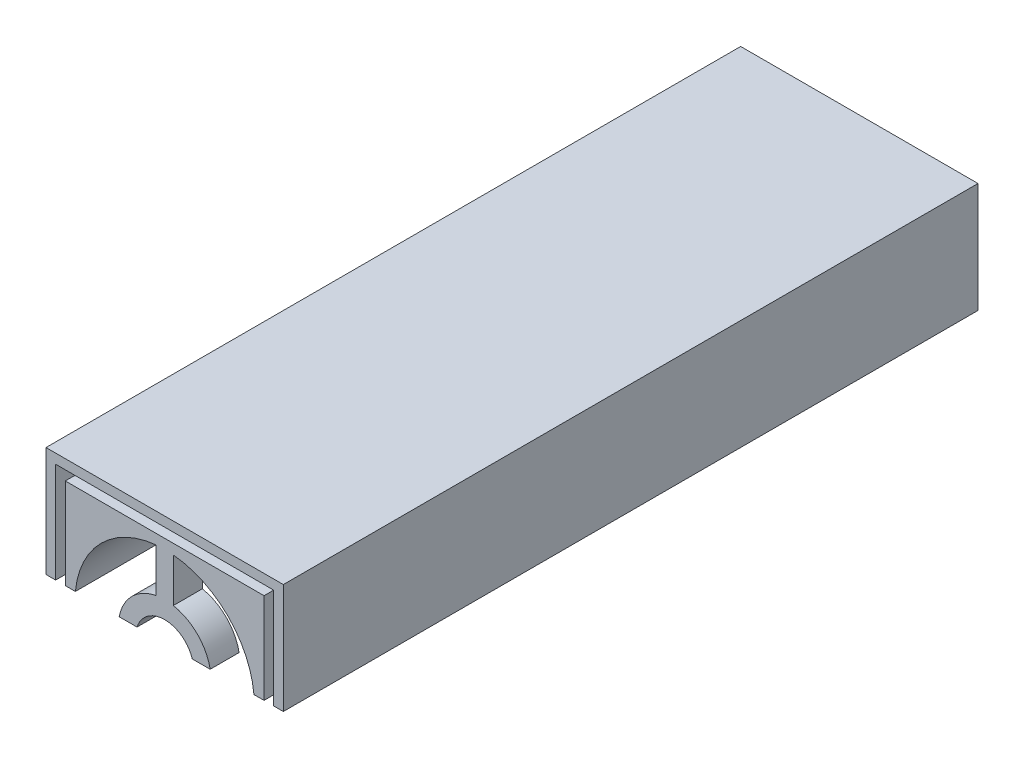
ISO-10303-21;
HEADER;
FILE_DESCRIPTION(('STEP AP214'),'2;1');
FILE_NAME('part.step','',(''),(''),'','','');
FILE_SCHEMA(('AUTOMOTIVE_DESIGN { 1 0 10303 214 1 1 1 1 }'));
ENDSEC;
DATA;
#1=APPLICATION_CONTEXT('core data for automotive mechanical design processes');
#2=APPLICATION_PROTOCOL_DEFINITION('international standard','automotive_design',2000,#1);
#3=PRODUCT_CONTEXT('',#1,'mechanical');
#4=PRODUCT('Part','Part','',(#3));
#5=PRODUCT_RELATED_PRODUCT_CATEGORY('part','',(#4));
#6=PRODUCT_DEFINITION_FORMATION('','',#4);
#7=PRODUCT_DEFINITION_CONTEXT('part definition',#1,'design');
#8=PRODUCT_DEFINITION('design','',#6,#7);
#9=PRODUCT_DEFINITION_SHAPE('','',#8);
#10=(LENGTH_UNIT() NAMED_UNIT(*) SI_UNIT(.MILLI.,.METRE.));
#11=(NAMED_UNIT(*) PLANE_ANGLE_UNIT() SI_UNIT($,.RADIAN.));
#12=(NAMED_UNIT(*) SI_UNIT($,.STERADIAN.) SOLID_ANGLE_UNIT());
#13=UNCERTAINTY_MEASURE_WITH_UNIT(LENGTH_MEASURE(1.E-05),#10,'distance_accuracy_value','');
#14=(GEOMETRIC_REPRESENTATION_CONTEXT(3) GLOBAL_UNCERTAINTY_ASSIGNED_CONTEXT((#13)) GLOBAL_UNIT_ASSIGNED_CONTEXT((#10,
#11,#12)) REPRESENTATION_CONTEXT('',''));
#15=CARTESIAN_POINT('',(0.,0.,0.));
#16=DIRECTION('',(0.,0.,1.));
#17=DIRECTION('',(1.,0.,0.));
#18=AXIS2_PLACEMENT_3D('',#15,#16,#17);
#19=CARTESIAN_POINT('',(0.,1.905,0.));
#20=DIRECTION('',(0.,1.,0.));
#21=DIRECTION('',(0.,0.,1.));
#22=AXIS2_PLACEMENT_3D('',#19,#20,#21);
#23=PLANE('',#22);
#24=DIRECTION('',(-1.,0.,0.));
#25=VECTOR('',#24,1.);
#26=CARTESIAN_POINT('',(0.,1.905,0.));
#27=LINE('',#26,#25);
#28=CARTESIAN_POINT('',(21.8017598,1.905,0.));
#29=VERTEX_POINT('',#28);
#30=CARTESIAN_POINT('',(19.5926057480877,1.905,0.));
#31=VERTEX_POINT('',#30);
#32=EDGE_CURVE('E571',#29,#31,#27,.T.);
#33=ORIENTED_EDGE('',*,*,#32,.T.);
#34=DIRECTION('',(0.,0.,1.));
#35=VECTOR('',#34,1.);
#36=CARTESIAN_POINT('',(19.5926057480877,1.905,-146.05));
#37=LINE('',#36,#35);
#38=CARTESIAN_POINT('',(19.5926057480877,1.905,-146.05));
#39=VERTEX_POINT('',#38);
#40=EDGE_CURVE('E526',#39,#31,#37,.T.);
#41=ORIENTED_EDGE('',*,*,#40,.F.);
#42=DIRECTION('',(-1.,0.,0.));
#43=VECTOR('',#42,1.);
#44=CARTESIAN_POINT('',(0.,1.905,-146.05));
#45=LINE('',#44,#43);
#46=CARTESIAN_POINT('',(6.05751392899761,1.905,-146.05));
#47=VERTEX_POINT('',#46);
#48=EDGE_CURVE('E550',#39,#47,#45,.T.);
#49=ORIENTED_EDGE('',*,*,#48,.T.);
#50=DIRECTION('',(0.,0.,1.));
#51=VECTOR('',#50,1.);
#52=CARTESIAN_POINT('',(6.0575139289976,1.905,-152.4));
#53=LINE('',#52,#51);
#54=CARTESIAN_POINT('',(6.05751392899761,1.905,-152.4));
#55=VERTEX_POINT('',#54);
#56=EDGE_CURVE('E541',#55,#47,#53,.T.);
#57=ORIENTED_EDGE('',*,*,#56,.F.);
#58=DIRECTION('',(-1.,0.,0.));
#59=VECTOR('',#58,1.);
#60=CARTESIAN_POINT('',(0.,1.905,-152.4));
#61=LINE('',#60,#59);
#62=CARTESIAN_POINT('',(26.035,1.905,-152.4));
#63=VERTEX_POINT('',#62);
#64=EDGE_CURVE('E551',#63,#55,#61,.T.);
#65=ORIENTED_EDGE('',*,*,#64,.F.);
#66=DIRECTION('',(0.,0.,1.));
#67=VECTOR('',#66,1.);
#68=CARTESIAN_POINT('',(26.035,1.905,-152.4));
#69=LINE('',#68,#67);
#70=CARTESIAN_POINT('',(26.035,1.905,0.));
#71=VERTEX_POINT('',#70);
#72=EDGE_CURVE('E555',#63,#71,#69,.T.);
#73=ORIENTED_EDGE('',*,*,#72,.T.);
#74=DIRECTION('',(-1.,0.,0.));
#75=VECTOR('',#74,1.);
#76=CARTESIAN_POINT('',(0.,1.905,0.));
#77=LINE('',#76,#75);
#78=CARTESIAN_POINT('',(23.9183418,1.905,0.));
#79=VERTEX_POINT('',#78);
#80=EDGE_CURVE('E553',#71,#79,#77,.T.);
#81=ORIENTED_EDGE('',*,*,#80,.T.);
#82=DIRECTION('',(0.,0.,1.));
#83=VECTOR('',#82,1.);
#84=CARTESIAN_POINT('',(23.9183418,1.905,-12.7));
#85=LINE('',#84,#83);
#86=CARTESIAN_POINT('',(23.9183418,1.905,-12.7));
#87=VERTEX_POINT('',#86);
#88=EDGE_CURVE('E572',#87,#79,#85,.T.);
#89=ORIENTED_EDGE('',*,*,#88,.F.);
#90=DIRECTION('',(-1.,0.,0.));
#91=VECTOR('',#90,1.);
#92=CARTESIAN_POINT('',(0.,1.905,-12.7));
#93=LINE('',#92,#91);
#94=CARTESIAN_POINT('',(21.8017598,1.905,-12.7));
#95=VERTEX_POINT('',#94);
#96=EDGE_CURVE('E578',#87,#95,#93,.T.);
#97=ORIENTED_EDGE('',*,*,#96,.T.);
#98=DIRECTION('',(0.,0.,1.));
#99=VECTOR('',#98,1.);
#100=CARTESIAN_POINT('',(21.8017598,1.905,-12.7));
#101=LINE('',#100,#99);
#102=EDGE_CURVE('E558',#95,#29,#101,.T.);
#103=ORIENTED_EDGE('',*,*,#102,.T.);
#104=EDGE_LOOP('',(#33,#41,#49,#57,#65,#73,#81,#89,#97,#103));
#105=FACE_BOUND('',#104,.T.);
#106=DIRECTION('',(0.,0.,1.));
#107=VECTOR('',#106,1.);
#108=CARTESIAN_POINT('',(10.3216057480877,1.905,0.));
#109=LINE('',#108,#107);
#110=CARTESIAN_POINT('',(10.3216057480877,1.905,-150.749));
#111=VERTEX_POINT('',#110);
#112=CARTESIAN_POINT('',(10.3216057480877,1.905,-147.701));
#113=VERTEX_POINT('',#112);
#114=EDGE_CURVE('E340',#111,#113,#109,.T.);
#115=ORIENTED_EDGE('',*,*,#114,.T.);
#116=DIRECTION('',(-1.,0.,0.));
#117=VECTOR('',#116,1.);
#118=CARTESIAN_POINT('',(0.,1.905,-147.701));
#119=LINE('',#118,#117);
#120=CARTESIAN_POINT('',(21.2436057480877,1.905,-147.701));
#121=VERTEX_POINT('',#120);
#122=EDGE_CURVE('E348',#121,#113,#119,.T.);
#123=ORIENTED_EDGE('',*,*,#122,.F.);
#124=DIRECTION('',(0.,0.,1.));
#125=VECTOR('',#124,1.);
#126=CARTESIAN_POINT('',(21.2436057480877,1.905,-150.749));
#127=LINE('',#126,#125);
#128=CARTESIAN_POINT('',(21.2436057480877,1.905,-19.05));
#129=VERTEX_POINT('',#128);
#130=EDGE_CURVE('E370',#121,#129,#127,.T.);
#131=ORIENTED_EDGE('',*,*,#130,.T.);
#132=DIRECTION('',(-1.,0.,0.));
#133=VECTOR('',#132,1.);
#134=CARTESIAN_POINT('',(24.2916057480877,1.905,-19.05));
#135=LINE('',#134,#133);
#136=CARTESIAN_POINT('',(24.2916057480877,1.905,-19.05));
#137=VERTEX_POINT('',#136);
#138=EDGE_CURVE('E112',#137,#129,#135,.T.);
#139=ORIENTED_EDGE('',*,*,#138,.F.);
#140=DIRECTION('',(0.,0.,1.));
#141=VECTOR('',#140,1.);
#142=CARTESIAN_POINT('',(24.2916057480877,1.905,-150.749));
#143=LINE('',#142,#141);
#144=CARTESIAN_POINT('',(24.2916057480877,1.905,-150.749));
#145=VERTEX_POINT('',#144);
#146=EDGE_CURVE('E365',#145,#137,#143,.T.);
#147=ORIENTED_EDGE('',*,*,#146,.F.);
#148=DIRECTION('',(-1.,0.,0.));
#149=VECTOR('',#148,1.);
#150=CARTESIAN_POINT('',(0.,1.905,-150.749));
#151=LINE('',#150,#149);
#152=EDGE_CURVE('E351',#145,#111,#151,.T.);
#153=ORIENTED_EDGE('',*,*,#152,.T.);
#154=EDGE_LOOP('',(#115,#123,#131,#139,#147,#153));
#155=FACE_BOUND('',#154,.T.);
#156=ADVANCED_FACE('F87',(#105,#155),#23,.F.);
#157=DIRECTION('',(0.,0.,1.));
#158=VECTOR('',#157,1.);
#159=CARTESIAN_POINT('',(-9.97980836489359,1.905,-6.35));
#160=LINE('',#159,#158);
#161=CARTESIAN_POINT('',(-9.97980836489359,1.905,-6.35));
#162=VERTEX_POINT('',#161);
#163=CARTESIAN_POINT('',(-9.97980836489359,1.905,0.));
#164=VERTEX_POINT('',#163);
#165=EDGE_CURVE('E453',#162,#164,#160,.T.);
#166=ORIENTED_EDGE('',*,*,#165,.F.);
#167=DIRECTION('',(-1.,0.,0.));
#168=VECTOR('',#167,1.);
#169=CARTESIAN_POINT('',(0.,1.905,-6.35));
#170=LINE('',#169,#168);
#171=CARTESIAN_POINT('',(-6.05751392899761,1.905,-6.34999999999999));
#172=VERTEX_POINT('',#171);
#173=EDGE_CURVE('E566',#172,#162,#170,.T.);
#174=ORIENTED_EDGE('',*,*,#173,.F.);
#175=DIRECTION('',(0.,0.,1.));
#176=VECTOR('',#175,1.);
#177=CARTESIAN_POINT('',(-6.0575139289976,1.905,-152.4));
#178=LINE('',#177,#176);
#179=CARTESIAN_POINT('',(-6.05751392899761,1.905,0.));
#180=VERTEX_POINT('',#179);
#181=EDGE_CURVE('E91',#180,#172,#178,.F.);
#182=ORIENTED_EDGE('',*,*,#181,.F.);
#183=EDGE_CURVE('E570',#180,#164,#27,.T.);
#184=ORIENTED_EDGE('',*,*,#183,.T.);
#185=EDGE_LOOP('',(#166,#174,#182,#184));
#186=FACE_BOUND('',#185,.T.);
#187=ADVANCED_FACE('F89',(#186),#23,.F.);
#188=DIRECTION('',(0.,0.,1.));
#189=VECTOR('',#188,1.);
#190=CARTESIAN_POINT('',(9.97980836489359,1.905,-6.35));
#191=LINE('',#190,#189);
#192=CARTESIAN_POINT('',(9.97980836489359,1.905,-6.35));
#193=VERTEX_POINT('',#192);
#194=CARTESIAN_POINT('',(9.97980836489359,1.905,0.));
#195=VERTEX_POINT('',#194);
#196=EDGE_CURVE('E12',#193,#195,#191,.T.);
#197=ORIENTED_EDGE('',*,*,#196,.T.);
#198=CARTESIAN_POINT('',(6.05751392899761,1.905,0.));
#199=VERTEX_POINT('',#198);
#200=EDGE_CURVE('E654',#195,#199,#27,.T.);
#201=ORIENTED_EDGE('',*,*,#200,.T.);
#202=DIRECTION('',(0.,0.,1.));
#203=VECTOR('',#202,1.);
#204=CARTESIAN_POINT('',(6.0575139289976,1.905,-152.4));
#205=LINE('',#204,#203);
#206=CARTESIAN_POINT('',(6.05751392899761,1.905,-6.34999999999999));
#207=VERTEX_POINT('',#206);
#208=EDGE_CURVE('E547',#207,#199,#205,.T.);
#209=ORIENTED_EDGE('',*,*,#208,.F.);
#210=EDGE_CURVE('E563',#193,#207,#170,.T.);
#211=ORIENTED_EDGE('',*,*,#210,.F.);
#212=EDGE_LOOP('',(#197,#201,#209,#211));
#213=FACE_BOUND('',#212,.T.);
#214=ADVANCED_FACE('F675',(#213),#23,.F.);
#215=DIRECTION('',(1.,0.,0.));
#216=VECTOR('',#215,1.);
#217=CARTESIAN_POINT('',(0.,1.905,-147.701));
#218=LINE('',#217,#216);
#219=CARTESIAN_POINT('',(-21.336,1.905,-147.701));
#220=VERTEX_POINT('',#219);
#221=CARTESIAN_POINT('',(-10.414,1.905,-147.701));
#222=VERTEX_POINT('',#221);
#223=EDGE_CURVE('E104',#220,#222,#218,.T.);
#224=ORIENTED_EDGE('',*,*,#223,.T.);
#225=DIRECTION('',(0.,0.,1.));
#226=VECTOR('',#225,1.);
#227=CARTESIAN_POINT('',(-10.414,1.905,0.));
#228=LINE('',#227,#226);
#229=CARTESIAN_POINT('',(-10.414,1.905,-150.749));
#230=VERTEX_POINT('',#229);
#231=EDGE_CURVE('E388',#230,#222,#228,.T.);
#232=ORIENTED_EDGE('',*,*,#231,.F.);
#233=DIRECTION('',(1.,0.,0.));
#234=VECTOR('',#233,1.);
#235=CARTESIAN_POINT('',(-24.384,1.905,-150.749));
#236=LINE('',#235,#234);
#237=CARTESIAN_POINT('',(-24.384,1.905,-150.749));
#238=VERTEX_POINT('',#237);
#239=EDGE_CURVE('E396',#238,#230,#236,.T.);
#240=ORIENTED_EDGE('',*,*,#239,.F.);
#241=DIRECTION('',(0.,0.,-1.));
#242=VECTOR('',#241,1.);
#243=CARTESIAN_POINT('',(-24.384,1.905,-19.05));
#244=LINE('',#243,#242);
#245=CARTESIAN_POINT('',(-24.384,1.905,-19.05));
#246=VERTEX_POINT('',#245);
#247=EDGE_CURVE('E373',#246,#238,#244,.T.);
#248=ORIENTED_EDGE('',*,*,#247,.F.);
#249=DIRECTION('',(1.,0.,0.));
#250=VECTOR('',#249,1.);
#251=CARTESIAN_POINT('',(-24.384,1.905,-19.05));
#252=LINE('',#251,#250);
#253=CARTESIAN_POINT('',(-21.336,1.905,-19.05));
#254=VERTEX_POINT('',#253);
#255=EDGE_CURVE('E389',#246,#254,#252,.T.);
#256=ORIENTED_EDGE('',*,*,#255,.T.);
#257=DIRECTION('',(0.,0.,-1.));
#258=VECTOR('',#257,1.);
#259=CARTESIAN_POINT('',(-21.336,1.905,-19.05));
#260=LINE('',#259,#258);
#261=EDGE_CURVE('E392',#254,#220,#260,.T.);
#262=ORIENTED_EDGE('',*,*,#261,.T.);
#263=EDGE_LOOP('',(#224,#232,#240,#248,#256,#262));
#264=FACE_BOUND('',#263,.T.);
#265=CARTESIAN_POINT('',(-19.5926057480877,1.905,0.));
#266=VERTEX_POINT('',#265);
#267=CARTESIAN_POINT('',(-21.8017598,1.905,0.));
#268=VERTEX_POINT('',#267);
#269=EDGE_CURVE('E567',#266,#268,#27,.T.);
#270=ORIENTED_EDGE('',*,*,#269,.T.);
#271=DIRECTION('',(0.,0.,1.));
#272=VECTOR('',#271,1.);
#273=CARTESIAN_POINT('',(-21.8017598,1.905,-12.7));
#274=LINE('',#273,#272);
#275=CARTESIAN_POINT('',(-21.8017598,1.905,-12.7));
#276=VERTEX_POINT('',#275);
#277=EDGE_CURVE('E565',#276,#268,#274,.T.);
#278=ORIENTED_EDGE('',*,*,#277,.F.);
#279=CARTESIAN_POINT('',(-23.9183418,1.905,-12.7));
#280=VERTEX_POINT('',#279);
#281=EDGE_CURVE('E575',#276,#280,#93,.T.);
#282=ORIENTED_EDGE('',*,*,#281,.T.);
#283=DIRECTION('',(0.,0.,1.));
#284=VECTOR('',#283,1.);
#285=CARTESIAN_POINT('',(-23.9183418,1.905,-12.7));
#286=LINE('',#285,#284);
#287=CARTESIAN_POINT('',(-23.9183418,1.905,0.));
#288=VERTEX_POINT('',#287);
#289=EDGE_CURVE('E580',#280,#288,#286,.T.);
#290=ORIENTED_EDGE('',*,*,#289,.T.);
#291=CARTESIAN_POINT('',(-26.035,1.905,0.));
#292=VERTEX_POINT('',#291);
#293=EDGE_CURVE('E560',#288,#292,#77,.T.);
#294=ORIENTED_EDGE('',*,*,#293,.T.);
#295=DIRECTION('',(0.,0.,-1.));
#296=VECTOR('',#295,1.);
#297=CARTESIAN_POINT('',(-26.035,1.905,-152.4));
#298=LINE('',#297,#296);
#299=CARTESIAN_POINT('',(-26.035,1.905,-152.4));
#300=VERTEX_POINT('',#299);
#301=EDGE_CURVE('E559',#292,#300,#298,.T.);
#302=ORIENTED_EDGE('',*,*,#301,.T.);
#303=CARTESIAN_POINT('',(-6.05751392899761,1.905,-152.4));
#304=VERTEX_POINT('',#303);
#305=EDGE_CURVE('E554',#304,#300,#61,.T.);
#306=ORIENTED_EDGE('',*,*,#305,.F.);
#307=DIRECTION('',(0.,0.,1.));
#308=VECTOR('',#307,1.);
#309=CARTESIAN_POINT('',(-6.0575139289976,1.905,-152.4));
#310=LINE('',#309,#308);
#311=CARTESIAN_POINT('',(-6.05751392899761,1.905,-146.05));
#312=VERTEX_POINT('',#311);
#313=EDGE_CURVE('E545',#312,#304,#310,.F.);
#314=ORIENTED_EDGE('',*,*,#313,.F.);
#315=CARTESIAN_POINT('',(-19.5926057480877,1.905,-146.05));
#316=VERTEX_POINT('',#315);
#317=EDGE_CURVE('E96',#312,#316,#45,.T.);
#318=ORIENTED_EDGE('',*,*,#317,.T.);
#319=DIRECTION('',(0.,0.,1.));
#320=VECTOR('',#319,1.);
#321=CARTESIAN_POINT('',(-19.5926057480877,1.905,-146.05));
#322=LINE('',#321,#320);
#323=EDGE_CURVE('E539',#266,#316,#322,.F.);
#324=ORIENTED_EDGE('',*,*,#323,.F.);
#325=EDGE_LOOP('',(#270,#278,#282,#290,#294,#302,#306,#314,#318,#324));
#326=FACE_BOUND('',#325,.T.);
#327=ADVANCED_FACE('F592',(#264,#326),#23,.F.);
#328=CARTESIAN_POINT('',(26.035,26.035,-152.4));
#329=DIRECTION('',(0.,1.,0.));
#330=DIRECTION('',(-1.,0.,0.));
#331=AXIS2_PLACEMENT_3D('',#328,#329,#330);
#332=PLANE('',#331);
#333=DIRECTION('',(-1.,0.,0.));
#334=VECTOR('',#333,1.);
#335=CARTESIAN_POINT('',(26.035,26.035,0.));
#336=LINE('',#335,#334);
#337=CARTESIAN_POINT('',(26.035,26.035,0.));
#338=VERTEX_POINT('',#337);
#339=CARTESIAN_POINT('',(-26.035,26.035,0.));
#340=VERTEX_POINT('',#339);
#341=EDGE_CURVE('E512',#338,#340,#336,.T.);
#342=ORIENTED_EDGE('',*,*,#341,.F.);
#343=DIRECTION('',(0.,0.,1.));
#344=VECTOR('',#343,1.);
#345=CARTESIAN_POINT('',(26.035,26.035,-152.4));
#346=LINE('',#345,#344);
#347=CARTESIAN_POINT('',(26.035,26.035,-152.4));
#348=VERTEX_POINT('',#347);
#349=EDGE_CURVE('E517',#348,#338,#346,.T.);
#350=ORIENTED_EDGE('',*,*,#349,.F.);
#351=DIRECTION('',(-1.,0.,0.));
#352=VECTOR('',#351,1.);
#353=CARTESIAN_POINT('',(26.035,26.035,-152.4));
#354=LINE('',#353,#352);
#355=CARTESIAN_POINT('',(-26.035,26.035,-152.4));
#356=VERTEX_POINT('',#355);
#357=EDGE_CURVE('E514',#348,#356,#354,.T.);
#358=ORIENTED_EDGE('',*,*,#357,.T.);
#359=DIRECTION('',(0.,0.,1.));
#360=VECTOR('',#359,1.);
#361=CARTESIAN_POINT('',(-26.035,26.035,-152.4));
#362=LINE('',#361,#360);
#363=EDGE_CURVE('E524',#356,#340,#362,.T.);
#364=ORIENTED_EDGE('',*,*,#363,.T.);
#365=EDGE_LOOP('',(#342,#350,#358,#364));
#366=FACE_BOUND('',#365,.T.);
#367=ADVANCED_FACE('F693',(#366),#332,.T.);
#368=CARTESIAN_POINT('',(-26.035,-26.035,-152.4));
#369=DIRECTION('',(-1.,0.,0.));
#370=DIRECTION('',(0.,0.,1.));
#371=AXIS2_PLACEMENT_3D('',#368,#369,#370);
#372=PLANE('',#371);
#373=ORIENTED_EDGE('',*,*,#301,.F.);
#374=DIRECTION('',(0.,-1.,0.));
#375=VECTOR('',#374,1.);
#376=CARTESIAN_POINT('',(-26.035,-26.035,0.));
#377=LINE('',#376,#375);
#378=EDGE_CURVE('E499',#340,#292,#377,.T.);
#379=ORIENTED_EDGE('',*,*,#378,.F.);
#380=ORIENTED_EDGE('',*,*,#363,.F.);
#381=DIRECTION('',(0.,-1.,0.));
#382=VECTOR('',#381,1.);
#383=CARTESIAN_POINT('',(-26.035,-26.035,-152.4));
#384=LINE('',#383,#382);
#385=EDGE_CURVE('E508',#356,#300,#384,.T.);
#386=ORIENTED_EDGE('',*,*,#385,.T.);
#387=EDGE_LOOP('',(#373,#379,#380,#386));
#388=FACE_BOUND('',#387,.T.);
#389=ADVANCED_FACE('F618',(#388),#372,.T.);
#390=CARTESIAN_POINT('',(26.035,-26.035,-152.4));
#391=DIRECTION('',(1.,0.,0.));
#392=DIRECTION('',(0.,0.,-1.));
#393=AXIS2_PLACEMENT_3D('',#390,#391,#392);
#394=PLANE('',#393);
#395=ORIENTED_EDGE('',*,*,#72,.F.);
#396=DIRECTION('',(0.,1.,0.));
#397=VECTOR('',#396,1.);
#398=CARTESIAN_POINT('',(26.035,-26.035,-152.4));
#399=LINE('',#398,#397);
#400=EDGE_CURVE('E511',#63,#348,#399,.T.);
#401=ORIENTED_EDGE('',*,*,#400,.T.);
#402=ORIENTED_EDGE('',*,*,#349,.T.);
#403=DIRECTION('',(0.,1.,0.));
#404=VECTOR('',#403,1.);
#405=CARTESIAN_POINT('',(26.035,-26.035,0.));
#406=LINE('',#405,#404);
#407=EDGE_CURVE('E520',#71,#338,#406,.T.);
#408=ORIENTED_EDGE('',*,*,#407,.F.);
#409=EDGE_LOOP('',(#395,#401,#402,#408));
#410=FACE_BOUND('',#409,.T.);
#411=ADVANCED_FACE('F734',(#410),#394,.T.);
#412=CARTESIAN_POINT('',(0.,0.,0.));
#413=DIRECTION('',(0.,0.,1.));
#414=DIRECTION('',(1.,0.,0.));
#415=AXIS2_PLACEMENT_3D('',#412,#413,#414);
#416=PLANE('',#415);
#417=ORIENTED_EDGE('',*,*,#80,.F.);
#418=ORIENTED_EDGE('',*,*,#407,.T.);
#419=ORIENTED_EDGE('',*,*,#341,.T.);
#420=ORIENTED_EDGE('',*,*,#378,.T.);
#421=ORIENTED_EDGE('',*,*,#293,.F.);
#422=DIRECTION('',(0.,1.,0.));
#423=VECTOR('',#422,1.);
#424=CARTESIAN_POINT('',(-23.9183418,0.,0.));
#425=LINE('',#424,#423);
#426=CARTESIAN_POINT('',(-23.9183418,23.9183418,0.));
#427=VERTEX_POINT('',#426);
#428=EDGE_CURVE('E465',#288,#427,#425,.T.);
#429=ORIENTED_EDGE('',*,*,#428,.T.);
#430=DIRECTION('',(-1.,0.,0.));
#431=VECTOR('',#430,1.);
#432=CARTESIAN_POINT('',(0.,23.9183418,0.));
#433=LINE('',#432,#431);
#434=CARTESIAN_POINT('',(23.9183418,23.9183418,0.));
#435=VERTEX_POINT('',#434);
#436=EDGE_CURVE('E487',#435,#427,#433,.T.);
#437=ORIENTED_EDGE('',*,*,#436,.F.);
#438=DIRECTION('',(0.,1.,0.));
#439=VECTOR('',#438,1.);
#440=CARTESIAN_POINT('',(23.9183418,0.,0.));
#441=LINE('',#440,#439);
#442=EDGE_CURVE('E485',#79,#435,#441,.T.);
#443=ORIENTED_EDGE('',*,*,#442,.F.);
#444=EDGE_LOOP('',(#417,#418,#419,#420,#421,#429,#437,#443));
#445=FACE_BOUND('',#444,.T.);
#446=ADVANCED_FACE('F613',(#445),#416,.T.);
#447=CARTESIAN_POINT('',(-21.8017598,0.,-12.7));
#448=DIRECTION('',(1.,0.,0.));
#449=DIRECTION('',(0.,0.,-1.));
#450=AXIS2_PLACEMENT_3D('',#447,#448,#449);
#451=PLANE('',#450);
#452=DIRECTION('',(0.,1.,0.));
#453=VECTOR('',#452,1.);
#454=CARTESIAN_POINT('',(-21.8017598,0.,-12.7));
#455=LINE('',#454,#453);
#456=CARTESIAN_POINT('',(-21.8017598,21.8017598,-12.7));
#457=VERTEX_POINT('',#456);
#458=EDGE_CURVE('E476',#276,#457,#455,.T.);
#459=ORIENTED_EDGE('',*,*,#458,.F.);
#460=ORIENTED_EDGE('',*,*,#277,.T.);
#461=DIRECTION('',(0.,1.,0.));
#462=VECTOR('',#461,1.);
#463=CARTESIAN_POINT('',(-21.8017598,0.,0.));
#464=LINE('',#463,#462);
#465=CARTESIAN_POINT('',(-21.8017598,21.8017598,0.));
#466=VERTEX_POINT('',#465);
#467=EDGE_CURVE('E490',#268,#466,#464,.T.);
#468=ORIENTED_EDGE('',*,*,#467,.T.);
#469=DIRECTION('',(0.,0.,1.));
#470=VECTOR('',#469,1.);
#471=CARTESIAN_POINT('',(-21.8017598,21.8017598,-12.7));
#472=LINE('',#471,#470);
#473=EDGE_CURVE('E500',#457,#466,#472,.T.);
#474=ORIENTED_EDGE('',*,*,#473,.F.);
#475=EDGE_LOOP('',(#459,#460,#468,#474));
#476=FACE_BOUND('',#475,.T.);
#477=ADVANCED_FACE('F587',(#476),#451,.F.);
#478=CARTESIAN_POINT('',(0.,21.8017598,-12.7));
#479=DIRECTION('',(0.,1.,0.));
#480=DIRECTION('',(0.,0.,1.));
#481=AXIS2_PLACEMENT_3D('',#478,#479,#480);
#482=PLANE('',#481);
#483=ORIENTED_EDGE('',*,*,#473,.T.);
#484=DIRECTION('',(-1.,0.,0.));
#485=VECTOR('',#484,1.);
#486=CARTESIAN_POINT('',(0.,21.8017598,0.));
#487=LINE('',#486,#485);
#488=CARTESIAN_POINT('',(21.8017598,21.8017598,0.));
#489=VERTEX_POINT('',#488);
#490=EDGE_CURVE('E492',#489,#466,#487,.T.);
#491=ORIENTED_EDGE('',*,*,#490,.F.);
#492=DIRECTION('',(0.,0.,1.));
#493=VECTOR('',#492,1.);
#494=CARTESIAN_POINT('',(21.8017598,21.8017598,-12.7));
#495=LINE('',#494,#493);
#496=CARTESIAN_POINT('',(21.8017598,21.8017598,-12.7));
#497=VERTEX_POINT('',#496);
#498=EDGE_CURVE('E496',#497,#489,#495,.T.);
#499=ORIENTED_EDGE('',*,*,#498,.F.);
#500=DIRECTION('',(-1.,0.,0.));
#501=VECTOR('',#500,1.);
#502=CARTESIAN_POINT('',(0.,21.8017598,-12.7));
#503=LINE('',#502,#501);
#504=EDGE_CURVE('E478',#497,#457,#503,.T.);
#505=ORIENTED_EDGE('',*,*,#504,.T.);
#506=EDGE_LOOP('',(#483,#491,#499,#505));
#507=FACE_BOUND('',#506,.T.);
#508=ADVANCED_FACE('F601',(#507),#482,.T.);
#509=CARTESIAN_POINT('',(21.8017598,0.,-12.7));
#510=DIRECTION('',(1.,0.,0.));
#511=DIRECTION('',(0.,0.,-1.));
#512=AXIS2_PLACEMENT_3D('',#509,#510,#511);
#513=PLANE('',#512);
#514=ORIENTED_EDGE('',*,*,#102,.F.);
#515=DIRECTION('',(0.,1.,0.));
#516=VECTOR('',#515,1.);
#517=CARTESIAN_POINT('',(21.8017598,0.,-12.7));
#518=LINE('',#517,#516);
#519=EDGE_CURVE('E481',#95,#497,#518,.T.);
#520=ORIENTED_EDGE('',*,*,#519,.T.);
#521=ORIENTED_EDGE('',*,*,#498,.T.);
#522=DIRECTION('',(0.,1.,0.));
#523=VECTOR('',#522,1.);
#524=CARTESIAN_POINT('',(21.8017598,0.,0.));
#525=LINE('',#524,#523);
#526=EDGE_CURVE('E471',#29,#489,#525,.T.);
#527=ORIENTED_EDGE('',*,*,#526,.F.);
#528=EDGE_LOOP('',(#514,#520,#521,#527));
#529=FACE_BOUND('',#528,.T.);
#530=ADVANCED_FACE('F717',(#529),#513,.T.);
#531=CARTESIAN_POINT('',(0.,0.,-152.4));
#532=DIRECTION('',(0.,0.,1.));
#533=DIRECTION('',(1.,0.,0.));
#534=AXIS2_PLACEMENT_3D('',#531,#532,#533);
#535=PLANE('',#534);
#536=ORIENTED_EDGE('',*,*,#400,.F.);
#537=ORIENTED_EDGE('',*,*,#64,.T.);
#538=CARTESIAN_POINT('',(0.,0.,-152.4));
#539=DIRECTION('',(0.,0.,1.));
#540=DIRECTION('',(1.,0.,0.));
#541=AXIS2_PLACEMENT_3D('',#538,#539,#540);
#542=CIRCLE('',#541,6.35);
#543=EDGE_CURVE('E423',#55,#304,#542,.T.);
#544=ORIENTED_EDGE('',*,*,#543,.T.);
#545=ORIENTED_EDGE('',*,*,#305,.T.);
#546=ORIENTED_EDGE('',*,*,#385,.F.);
#547=ORIENTED_EDGE('',*,*,#357,.F.);
#548=EDGE_LOOP('',(#536,#537,#544,#545,#546,#547));
#549=FACE_BOUND('',#548,.T.);
#550=ADVANCED_FACE('F625',(#549),#535,.F.);
#551=CARTESIAN_POINT('',(0.,0.,-146.05));
#552=DIRECTION('',(0.,0.,1.));
#553=DIRECTION('',(1.,0.,0.));
#554=AXIS2_PLACEMENT_3D('',#551,#552,#553);
#555=PLANE('',#554);
#556=ORIENTED_EDGE('',*,*,#48,.F.);
#557=CARTESIAN_POINT('',(0.,0.,-146.05));
#558=DIRECTION('',(0.,0.,1.));
#559=DIRECTION('',(1.,0.,0.));
#560=AXIS2_PLACEMENT_3D('',#557,#558,#559);
#561=CIRCLE('',#560,19.685);
#562=EDGE_CURVE('E462',#39,#316,#561,.T.);
#563=ORIENTED_EDGE('',*,*,#562,.T.);
#564=ORIENTED_EDGE('',*,*,#317,.F.);
#565=CARTESIAN_POINT('',(0.,0.,-146.05));
#566=DIRECTION('',(0.,0.,1.));
#567=DIRECTION('',(1.,0.,0.));
#568=AXIS2_PLACEMENT_3D('',#565,#566,#567);
#569=CIRCLE('',#568,6.35);
#570=EDGE_CURVE('E429',#47,#312,#569,.T.);
#571=ORIENTED_EDGE('',*,*,#570,.F.);
#572=EDGE_LOOP('',(#556,#563,#564,#571));
#573=FACE_BOUND('',#572,.T.);
#574=ADVANCED_FACE('F634',(#573),#555,.T.);
#575=CARTESIAN_POINT('',(0.,0.,-152.4));
#576=DIRECTION('',(0.,0.,1.));
#577=DIRECTION('',(1.,0.,0.));
#578=AXIS2_PLACEMENT_3D('',#575,#576,#577);
#579=CYLINDRICAL_SURFACE('',#578,6.35);
#580=ORIENTED_EDGE('',*,*,#570,.T.);
#581=ORIENTED_EDGE('',*,*,#313,.T.);
#582=ORIENTED_EDGE('',*,*,#543,.F.);
#583=ORIENTED_EDGE('',*,*,#56,.T.);
#584=EDGE_LOOP('',(#580,#581,#582,#583));
#585=FACE_BOUND('',#584,.T.);
#586=ADVANCED_FACE('F629',(#585),#579,.F.);
#587=CARTESIAN_POINT('',(0.,0.,-146.05));
#588=DIRECTION('',(0.,0.,1.));
#589=DIRECTION('',(1.,0.,0.));
#590=AXIS2_PLACEMENT_3D('',#587,#588,#589);
#591=CYLINDRICAL_SURFACE('',#590,19.685);
#592=ORIENTED_EDGE('',*,*,#323,.T.);
#593=ORIENTED_EDGE('',*,*,#562,.F.);
#594=ORIENTED_EDGE('',*,*,#40,.T.);
#595=CARTESIAN_POINT('',(0.,0.,0.));
#596=DIRECTION('',(0.,0.,1.));
#597=DIRECTION('',(1.,0.,0.));
#598=AXIS2_PLACEMENT_3D('',#595,#596,#597);
#599=CIRCLE('',#598,19.685);
#600=CARTESIAN_POINT('',(1.905,19.5926057480877,0.));
#601=VERTEX_POINT('',#600);
#602=EDGE_CURVE('E466',#31,#601,#599,.T.);
#603=ORIENTED_EDGE('',*,*,#602,.T.);
#604=DIRECTION('',(0.,0.,1.));
#605=VECTOR('',#604,1.);
#606=CARTESIAN_POINT('',(1.905,19.5926057480877,-146.05));
#607=LINE('',#606,#605);
#608=CARTESIAN_POINT('',(1.905,19.5926057480877,-6.34999999999999));
#609=VERTEX_POINT('',#608);
#610=EDGE_CURVE('E532',#609,#601,#607,.T.);
#611=ORIENTED_EDGE('',*,*,#610,.F.);
#612=CARTESIAN_POINT('',(0.,0.,-6.34999999999999));
#613=DIRECTION('',(0.,0.,1.));
#614=DIRECTION('',(1.,0.,0.));
#615=AXIS2_PLACEMENT_3D('',#612,#613,#614);
#616=CIRCLE('',#615,19.685);
#617=CARTESIAN_POINT('',(-1.90499999999999,19.5926057480877,-6.34999999999999));
#618=VERTEX_POINT('',#617);
#619=EDGE_CURVE('E529',#618,#609,#616,.F.);
#620=ORIENTED_EDGE('',*,*,#619,.F.);
#621=DIRECTION('',(0.,0.,1.));
#622=VECTOR('',#621,1.);
#623=CARTESIAN_POINT('',(-1.90499999999999,19.5926057480877,-146.05));
#624=LINE('',#623,#622);
#625=CARTESIAN_POINT('',(-1.90499999999999,19.5926057480877,0.));
#626=VERTEX_POINT('',#625);
#627=EDGE_CURVE('E536',#618,#626,#624,.T.);
#628=ORIENTED_EDGE('',*,*,#627,.T.);
#629=EDGE_CURVE('E456',#626,#266,#599,.T.);
#630=ORIENTED_EDGE('',*,*,#629,.T.);
#631=EDGE_LOOP('',(#592,#593,#594,#603,#611,#620,#628,#630));
#632=FACE_BOUND('',#631,.T.);
#633=ADVANCED_FACE('F637',(#632),#591,.F.);
#634=CARTESIAN_POINT('',(-1.90499999999999,0.,-6.35));
#635=DIRECTION('',(-1.,0.,0.));
#636=DIRECTION('',(0.,-1.,0.));
#637=AXIS2_PLACEMENT_3D('',#634,#635,#636);
#638=PLANE('',#637);
#639=ORIENTED_EDGE('',*,*,#627,.F.);
#640=DIRECTION('',(0.,-1.,0.));
#641=VECTOR('',#640,1.);
#642=CARTESIAN_POINT('',(-1.90499999999999,0.,-6.35));
#643=LINE('',#642,#641);
#644=CARTESIAN_POINT('',(-1.90499999999999,9.97980836489359,-6.35));
#645=VERTEX_POINT('',#644);
#646=EDGE_CURVE('E439',#618,#645,#643,.T.);
#647=ORIENTED_EDGE('',*,*,#646,.T.);
#648=DIRECTION('',(0.,0.,1.));
#649=VECTOR('',#648,1.);
#650=CARTESIAN_POINT('',(-1.90499999999999,9.97980836489359,-6.35));
#651=LINE('',#650,#649);
#652=CARTESIAN_POINT('',(-1.90499999999999,9.97980836489359,0.));
#653=VERTEX_POINT('',#652);
#654=EDGE_CURVE('E457',#645,#653,#651,.T.);
#655=ORIENTED_EDGE('',*,*,#654,.T.);
#656=DIRECTION('',(0.,-1.,0.));
#657=VECTOR('',#656,1.);
#658=CARTESIAN_POINT('',(-1.90499999999999,0.,0.));
#659=LINE('',#658,#657);
#660=EDGE_CURVE('E449',#626,#653,#659,.T.);
#661=ORIENTED_EDGE('',*,*,#660,.F.);
#662=EDGE_LOOP('',(#639,#647,#655,#661));
#663=FACE_BOUND('',#662,.T.);
#664=ADVANCED_FACE('F644',(#663),#638,.T.);
#665=CARTESIAN_POINT('',(1.905,0.,-6.35));
#666=DIRECTION('',(-1.,0.,0.));
#667=DIRECTION('',(0.,-1.,0.));
#668=AXIS2_PLACEMENT_3D('',#665,#666,#667);
#669=PLANE('',#668);
#670=DIRECTION('',(0.,-1.,0.));
#671=VECTOR('',#670,1.);
#672=CARTESIAN_POINT('',(1.905,0.,-6.35));
#673=LINE('',#672,#671);
#674=CARTESIAN_POINT('',(1.905,9.97980836489359,-6.35));
#675=VERTEX_POINT('',#674);
#676=EDGE_CURVE('E436',#609,#675,#673,.T.);
#677=ORIENTED_EDGE('',*,*,#676,.F.);
#678=ORIENTED_EDGE('',*,*,#610,.T.);
#679=DIRECTION('',(0.,-1.,0.));
#680=VECTOR('',#679,1.);
#681=CARTESIAN_POINT('',(1.905,0.,0.));
#682=LINE('',#681,#680);
#683=CARTESIAN_POINT('',(1.905,9.97980836489359,0.));
#684=VERTEX_POINT('',#683);
#685=EDGE_CURVE('E447',#601,#684,#682,.T.);
#686=ORIENTED_EDGE('',*,*,#685,.T.);
#687=DIRECTION('',(0.,0.,1.));
#688=VECTOR('',#687,1.);
#689=CARTESIAN_POINT('',(1.905,9.97980836489359,-6.35));
#690=LINE('',#689,#688);
#691=EDGE_CURVE('E444',#675,#684,#690,.T.);
#692=ORIENTED_EDGE('',*,*,#691,.F.);
#693=EDGE_LOOP('',(#677,#678,#686,#692));
#694=FACE_BOUND('',#693,.T.);
#695=ADVANCED_FACE('F665',(#694),#669,.F.);
#696=CARTESIAN_POINT('',(0.,0.,-6.35));
#697=DIRECTION('',(0.,0.,1.));
#698=DIRECTION('',(1.,0.,0.));
#699=AXIS2_PLACEMENT_3D('',#696,#697,#698);
#700=PLANE('',#699);
#701=CARTESIAN_POINT('',(0.,0.,-6.35));
#702=DIRECTION('',(0.,0.,1.));
#703=DIRECTION('',(1.,0.,0.));
#704=AXIS2_PLACEMENT_3D('',#701,#702,#703);
#705=CIRCLE('',#704,10.16);
#706=EDGE_CURVE('E433',#193,#675,#705,.T.);
#707=ORIENTED_EDGE('',*,*,#706,.F.);
#708=ORIENTED_EDGE('',*,*,#210,.T.);
#709=CARTESIAN_POINT('',(0.,0.,-6.34999999999999));
#710=DIRECTION('',(0.,0.,1.));
#711=DIRECTION('',(1.,0.,0.));
#712=AXIS2_PLACEMENT_3D('',#709,#710,#711);
#713=CIRCLE('',#712,6.35);
#714=EDGE_CURVE('E426',#207,#172,#713,.T.);
#715=ORIENTED_EDGE('',*,*,#714,.T.);
#716=ORIENTED_EDGE('',*,*,#173,.T.);
#717=CARTESIAN_POINT('',(0.,0.,-6.35));
#718=DIRECTION('',(0.,0.,1.));
#719=DIRECTION('',(1.,0.,0.));
#720=AXIS2_PLACEMENT_3D('',#717,#718,#719);
#721=CIRCLE('',#720,10.16);
#722=EDGE_CURVE('E441',#645,#162,#721,.T.);
#723=ORIENTED_EDGE('',*,*,#722,.F.);
#724=ORIENTED_EDGE('',*,*,#646,.F.);
#725=ORIENTED_EDGE('',*,*,#619,.T.);
#726=ORIENTED_EDGE('',*,*,#676,.T.);
#727=EDGE_LOOP('',(#707,#708,#715,#716,#723,#724,#725,#726));
#728=FACE_BOUND('',#727,.T.);
#729=ADVANCED_FACE('F669',(#728),#700,.F.);
#730=ORIENTED_EDGE('',*,*,#32,.F.);
#731=ORIENTED_EDGE('',*,*,#526,.T.);
#732=ORIENTED_EDGE('',*,*,#490,.T.);
#733=ORIENTED_EDGE('',*,*,#467,.F.);
#734=ORIENTED_EDGE('',*,*,#269,.F.);
#735=ORIENTED_EDGE('',*,*,#629,.F.);
#736=ORIENTED_EDGE('',*,*,#660,.T.);
#737=CARTESIAN_POINT('',(0.,0.,0.));
#738=DIRECTION('',(0.,0.,1.));
#739=DIRECTION('',(1.,0.,0.));
#740=AXIS2_PLACEMENT_3D('',#737,#738,#739);
#741=CIRCLE('',#740,10.16);
#742=EDGE_CURVE('E437',#653,#164,#741,.T.);
#743=ORIENTED_EDGE('',*,*,#742,.T.);
#744=ORIENTED_EDGE('',*,*,#183,.F.);
#745=CARTESIAN_POINT('',(0.,0.,0.));
#746=DIRECTION('',(0.,0.,1.));
#747=DIRECTION('',(1.,0.,0.));
#748=AXIS2_PLACEMENT_3D('',#745,#746,#747);
#749=CIRCLE('',#748,6.35);
#750=EDGE_CURVE('E360',#199,#180,#749,.T.);
#751=ORIENTED_EDGE('',*,*,#750,.F.);
#752=ORIENTED_EDGE('',*,*,#200,.F.);
#753=CARTESIAN_POINT('',(0.,0.,0.));
#754=DIRECTION('',(0.,0.,1.));
#755=DIRECTION('',(1.,0.,0.));
#756=AXIS2_PLACEMENT_3D('',#753,#754,#755);
#757=CIRCLE('',#756,10.16);
#758=EDGE_CURVE('E432',#195,#684,#757,.T.);
#759=ORIENTED_EDGE('',*,*,#758,.T.);
#760=ORIENTED_EDGE('',*,*,#685,.F.);
#761=ORIENTED_EDGE('',*,*,#602,.F.);
#762=EDGE_LOOP('',(#730,#731,#732,#733,#734,#735,#736,#743,#744,#751,#752,#759,#760,#761));
#763=FACE_BOUND('',#762,.T.);
#764=ADVANCED_FACE('F596',(#763),#416,.T.);
#765=ORIENTED_EDGE('',*,*,#750,.T.);
#766=ORIENTED_EDGE('',*,*,#181,.T.);
#767=ORIENTED_EDGE('',*,*,#714,.F.);
#768=ORIENTED_EDGE('',*,*,#208,.T.);
#769=EDGE_LOOP('',(#765,#766,#767,#768));
#770=FACE_BOUND('',#769,.T.);
#771=ADVANCED_FACE('F672',(#770),#579,.F.);
#772=CARTESIAN_POINT('',(0.,0.,-6.35));
#773=DIRECTION('',(0.,0.,1.));
#774=DIRECTION('',(1.,0.,0.));
#775=AXIS2_PLACEMENT_3D('',#772,#773,#774);
#776=CYLINDRICAL_SURFACE('',#775,10.16);
#777=ORIENTED_EDGE('',*,*,#758,.F.);
#778=ORIENTED_EDGE('',*,*,#196,.F.);
#779=ORIENTED_EDGE('',*,*,#706,.T.);
#780=ORIENTED_EDGE('',*,*,#691,.T.);
#781=EDGE_LOOP('',(#777,#778,#779,#780));
#782=FACE_BOUND('',#781,.T.);
#783=ADVANCED_FACE('F677',(#782),#776,.T.);
#784=CARTESIAN_POINT('',(0.,0.,-6.35));
#785=DIRECTION('',(0.,0.,1.));
#786=DIRECTION('',(1.,0.,0.));
#787=AXIS2_PLACEMENT_3D('',#784,#785,#786);
#788=CYLINDRICAL_SURFACE('',#787,10.16);
#789=ORIENTED_EDGE('',*,*,#742,.F.);
#790=ORIENTED_EDGE('',*,*,#654,.F.);
#791=ORIENTED_EDGE('',*,*,#722,.T.);
#792=ORIENTED_EDGE('',*,*,#165,.T.);
#793=EDGE_LOOP('',(#789,#790,#791,#792));
#794=FACE_BOUND('',#793,.T.);
#795=ADVANCED_FACE('F648',(#794),#788,.T.);
#796=CARTESIAN_POINT('',(-23.9183418,0.,-12.7));
#797=DIRECTION('',(1.,0.,0.));
#798=DIRECTION('',(0.,0.,-1.));
#799=AXIS2_PLACEMENT_3D('',#796,#797,#798);
#800=PLANE('',#799);
#801=ORIENTED_EDGE('',*,*,#289,.F.);
#802=DIRECTION('',(0.,1.,0.));
#803=VECTOR('',#802,1.);
#804=CARTESIAN_POINT('',(-23.9183418,0.,-12.7));
#805=LINE('',#804,#803);
#806=CARTESIAN_POINT('',(-23.9183418,23.9183418,-12.7));
#807=VERTEX_POINT('',#806);
#808=EDGE_CURVE('E468',#280,#807,#805,.T.);
#809=ORIENTED_EDGE('',*,*,#808,.T.);
#810=DIRECTION('',(0.,0.,1.));
#811=VECTOR('',#810,1.);
#812=CARTESIAN_POINT('',(-23.9183418,23.9183418,-12.7));
#813=LINE('',#812,#811);
#814=EDGE_CURVE('E503',#807,#427,#813,.T.);
#815=ORIENTED_EDGE('',*,*,#814,.T.);
#816=ORIENTED_EDGE('',*,*,#428,.F.);
#817=EDGE_LOOP('',(#801,#809,#815,#816));
#818=FACE_BOUND('',#817,.T.);
#819=ADVANCED_FACE('F609',(#818),#800,.T.);
#820=CARTESIAN_POINT('',(0.,23.9183418,-12.7));
#821=DIRECTION('',(0.,1.,0.));
#822=DIRECTION('',(0.,0.,1.));
#823=AXIS2_PLACEMENT_3D('',#820,#821,#822);
#824=PLANE('',#823);
#825=ORIENTED_EDGE('',*,*,#436,.T.);
#826=ORIENTED_EDGE('',*,*,#814,.F.);
#827=DIRECTION('',(-1.,0.,0.));
#828=VECTOR('',#827,1.);
#829=CARTESIAN_POINT('',(0.,23.9183418,-12.7));
#830=LINE('',#829,#828);
#831=CARTESIAN_POINT('',(23.9183418,23.9183418,-12.7));
#832=VERTEX_POINT('',#831);
#833=EDGE_CURVE('E473',#832,#807,#830,.T.);
#834=ORIENTED_EDGE('',*,*,#833,.F.);
#835=DIRECTION('',(0.,0.,1.));
#836=VECTOR('',#835,1.);
#837=CARTESIAN_POINT('',(23.9183418,23.9183418,-12.7));
#838=LINE('',#837,#836);
#839=EDGE_CURVE('E483',#832,#435,#838,.T.);
#840=ORIENTED_EDGE('',*,*,#839,.T.);
#841=EDGE_LOOP('',(#825,#826,#834,#840));
#842=FACE_BOUND('',#841,.T.);
#843=ADVANCED_FACE('F712',(#842),#824,.F.);
#844=CARTESIAN_POINT('',(23.9183418,0.,-12.7));
#845=DIRECTION('',(1.,0.,0.));
#846=DIRECTION('',(0.,0.,-1.));
#847=AXIS2_PLACEMENT_3D('',#844,#845,#846);
#848=PLANE('',#847);
#849=DIRECTION('',(0.,1.,0.));
#850=VECTOR('',#849,1.);
#851=CARTESIAN_POINT('',(23.9183418,0.,-12.7));
#852=LINE('',#851,#850);
#853=EDGE_CURVE('E470',#87,#832,#852,.T.);
#854=ORIENTED_EDGE('',*,*,#853,.F.);
#855=ORIENTED_EDGE('',*,*,#88,.T.);
#856=ORIENTED_EDGE('',*,*,#442,.T.);
#857=ORIENTED_EDGE('',*,*,#839,.F.);
#858=EDGE_LOOP('',(#854,#855,#856,#857));
#859=FACE_BOUND('',#858,.T.);
#860=ADVANCED_FACE('F703',(#859),#848,.F.);
#861=CARTESIAN_POINT('',(0.,0.,-12.7));
#862=DIRECTION('',(0.,0.,1.));
#863=DIRECTION('',(1.,0.,0.));
#864=AXIS2_PLACEMENT_3D('',#861,#862,#863);
#865=PLANE('',#864);
#866=ORIENTED_EDGE('',*,*,#96,.F.);
#867=ORIENTED_EDGE('',*,*,#853,.T.);
#868=ORIENTED_EDGE('',*,*,#833,.T.);
#869=ORIENTED_EDGE('',*,*,#808,.F.);
#870=ORIENTED_EDGE('',*,*,#281,.F.);
#871=ORIENTED_EDGE('',*,*,#458,.T.);
#872=ORIENTED_EDGE('',*,*,#504,.F.);
#873=ORIENTED_EDGE('',*,*,#519,.F.);
#874=EDGE_LOOP('',(#866,#867,#868,#869,#870,#871,#872,#873));
#875=FACE_BOUND('',#874,.T.);
#876=ADVANCED_FACE('F605',(#875),#865,.T.);
#877=CARTESIAN_POINT('',(10.3216057480877,7.493,0.));
#878=DIRECTION('',(1.,0.,0.));
#879=DIRECTION('',(0.,0.,-1.));
#880=AXIS2_PLACEMENT_3D('',#877,#878,#879);
#881=PLANE('',#880);
#882=ORIENTED_EDGE('',*,*,#114,.F.);
#883=DIRECTION('',(0.,-1.,0.));
#884=VECTOR('',#883,1.);
#885=CARTESIAN_POINT('',(10.3216057480877,7.493,-150.749));
#886=LINE('',#885,#884);
#887=CARTESIAN_POINT('',(10.3216057480877,7.493,-150.749));
#888=VERTEX_POINT('',#887);
#889=EDGE_CURVE('E325',#888,#111,#886,.T.);
#890=ORIENTED_EDGE('',*,*,#889,.F.);
#891=DIRECTION('',(0.,0.,1.));
#892=VECTOR('',#891,1.);
#893=CARTESIAN_POINT('',(10.3216057480877,7.493,0.));
#894=LINE('',#893,#892);
#895=CARTESIAN_POINT('',(10.3216057480877,7.493,-147.701));
#896=VERTEX_POINT('',#895);
#897=EDGE_CURVE('E334',#888,#896,#894,.T.);
#898=ORIENTED_EDGE('',*,*,#897,.T.);
#899=DIRECTION('',(0.,-1.,0.));
#900=VECTOR('',#899,1.);
#901=CARTESIAN_POINT('',(10.3216057480877,7.493,-147.701));
#902=LINE('',#901,#900);
#903=EDGE_CURVE('E358',#896,#113,#902,.T.);
#904=ORIENTED_EDGE('',*,*,#903,.T.);
#905=EDGE_LOOP('',(#882,#890,#898,#904));
#906=FACE_BOUND('',#905,.T.);
#907=ADVANCED_FACE('F337',(#906),#881,.T.);
#908=CARTESIAN_POINT('',(0.,7.493,-147.701));
#909=DIRECTION('',(0.,0.,1.));
#910=DIRECTION('',(1.,0.,0.));
#911=AXIS2_PLACEMENT_3D('',#908,#909,#910);
#912=PLANE('',#911);
#913=ORIENTED_EDGE('',*,*,#122,.T.);
#914=ORIENTED_EDGE('',*,*,#903,.F.);
#915=DIRECTION('',(-1.,0.,0.));
#916=VECTOR('',#915,1.);
#917=CARTESIAN_POINT('',(0.,7.493,-147.701));
#918=LINE('',#917,#916);
#919=CARTESIAN_POINT('',(21.2436057480877,7.493,-147.701));
#920=VERTEX_POINT('',#919);
#921=EDGE_CURVE('E333',#920,#896,#918,.T.);
#922=ORIENTED_EDGE('',*,*,#921,.F.);
#923=DIRECTION('',(0.,-1.,0.));
#924=VECTOR('',#923,1.);
#925=CARTESIAN_POINT('',(21.2436057480877,7.493,-147.701));
#926=LINE('',#925,#924);
#927=EDGE_CURVE('E342',#920,#121,#926,.T.);
#928=ORIENTED_EDGE('',*,*,#927,.T.);
#929=EDGE_LOOP('',(#913,#914,#922,#928));
#930=FACE_BOUND('',#929,.T.);
#931=ADVANCED_FACE('F709',(#930),#912,.F.);
#932=CARTESIAN_POINT('',(0.,7.493,-150.749));
#933=DIRECTION('',(0.,0.,1.));
#934=DIRECTION('',(1.,0.,0.));
#935=AXIS2_PLACEMENT_3D('',#932,#933,#934);
#936=PLANE('',#935);
#937=ORIENTED_EDGE('',*,*,#152,.F.);
#938=DIRECTION('',(0.,-1.,0.));
#939=VECTOR('',#938,1.);
#940=CARTESIAN_POINT('',(24.2916057480877,7.493,-150.749));
#941=LINE('',#940,#939);
#942=CARTESIAN_POINT('',(24.2916057480877,7.493,-150.749));
#943=VERTEX_POINT('',#942);
#944=EDGE_CURVE('E328',#943,#145,#941,.T.);
#945=ORIENTED_EDGE('',*,*,#944,.F.);
#946=DIRECTION('',(-1.,0.,0.));
#947=VECTOR('',#946,1.);
#948=CARTESIAN_POINT('',(0.,7.493,-150.749));
#949=LINE('',#948,#947);
#950=EDGE_CURVE('E322',#943,#888,#949,.T.);
#951=ORIENTED_EDGE('',*,*,#950,.T.);
#952=ORIENTED_EDGE('',*,*,#889,.T.);
#953=EDGE_LOOP('',(#937,#945,#951,#952));
#954=FACE_BOUND('',#953,.T.);
#955=ADVANCED_FACE('F324',(#954),#936,.T.);
#956=CARTESIAN_POINT('',(0.,7.493,0.));
#957=DIRECTION('',(0.,-1.,0.));
#958=DIRECTION('',(0.,0.,-1.));
#959=AXIS2_PLACEMENT_3D('',#956,#957,#958);
#960=PLANE('',#959);
#961=ORIENTED_EDGE('',*,*,#897,.F.);
#962=ORIENTED_EDGE('',*,*,#950,.F.);
#963=DIRECTION('',(0.,0.,1.));
#964=VECTOR('',#963,1.);
#965=CARTESIAN_POINT('',(24.2916057480877,7.493,-150.749));
#966=LINE('',#965,#964);
#967=CARTESIAN_POINT('',(24.2916057480877,7.493,-19.05));
#968=VERTEX_POINT('',#967);
#969=EDGE_CURVE('E368',#943,#968,#966,.T.);
#970=ORIENTED_EDGE('',*,*,#969,.T.);
#971=DIRECTION('',(-1.,0.,0.));
#972=VECTOR('',#971,1.);
#973=CARTESIAN_POINT('',(24.2916057480877,7.493,-19.05));
#974=LINE('',#973,#972);
#975=CARTESIAN_POINT('',(21.2436057480877,7.493,-19.05));
#976=VERTEX_POINT('',#975);
#977=EDGE_CURVE('E364',#968,#976,#974,.T.);
#978=ORIENTED_EDGE('',*,*,#977,.T.);
#979=DIRECTION('',(0.,0.,1.));
#980=VECTOR('',#979,1.);
#981=CARTESIAN_POINT('',(21.2436057480877,7.493,-150.749));
#982=LINE('',#981,#980);
#983=EDGE_CURVE('E362',#920,#976,#982,.T.);
#984=ORIENTED_EDGE('',*,*,#983,.F.);
#985=ORIENTED_EDGE('',*,*,#921,.T.);
#986=EDGE_LOOP('',(#961,#962,#970,#978,#984,#985));
#987=FACE_BOUND('',#986,.T.);
#988=ADVANCED_FACE('F345',(#987),#960,.T.);
#989=CARTESIAN_POINT('',(24.2916057480877,7.493,-150.749));
#990=DIRECTION('',(1.,0.,0.));
#991=DIRECTION('',(0.,0.,-1.));
#992=AXIS2_PLACEMENT_3D('',#989,#990,#991);
#993=PLANE('',#992);
#994=ORIENTED_EDGE('',*,*,#146,.T.);
#995=DIRECTION('',(0.,-1.,0.));
#996=VECTOR('',#995,1.);
#997=CARTESIAN_POINT('',(24.2916057480877,7.493,-19.05));
#998=LINE('',#997,#996);
#999=EDGE_CURVE('E378',#968,#137,#998,.T.);
#1000=ORIENTED_EDGE('',*,*,#999,.F.);
#1001=ORIENTED_EDGE('',*,*,#969,.F.);
#1002=ORIENTED_EDGE('',*,*,#944,.T.);
#1003=EDGE_LOOP('',(#994,#1000,#1001,#1002));
#1004=FACE_BOUND('',#1003,.T.);
#1005=ADVANCED_FACE('F711',(#1004),#993,.F.);
#1006=CARTESIAN_POINT('',(24.2916057480877,7.493,-19.05));
#1007=DIRECTION('',(0.,0.,1.));
#1008=DIRECTION('',(1.,0.,0.));
#1009=AXIS2_PLACEMENT_3D('',#1006,#1007,#1008);
#1010=PLANE('',#1009);
#1011=ORIENTED_EDGE('',*,*,#138,.T.);
#1012=DIRECTION('',(0.,-1.,0.));
#1013=VECTOR('',#1012,1.);
#1014=CARTESIAN_POINT('',(21.2436057480877,7.493,-19.05));
#1015=LINE('',#1014,#1013);
#1016=EDGE_CURVE('E356',#976,#129,#1015,.T.);
#1017=ORIENTED_EDGE('',*,*,#1016,.F.);
#1018=ORIENTED_EDGE('',*,*,#977,.F.);
#1019=ORIENTED_EDGE('',*,*,#999,.T.);
#1020=EDGE_LOOP('',(#1011,#1017,#1018,#1019));
#1021=FACE_BOUND('',#1020,.T.);
#1022=ADVANCED_FACE('F890',(#1021),#1010,.F.);
#1023=CARTESIAN_POINT('',(21.2436057480877,7.493,-150.749));
#1024=DIRECTION('',(1.,0.,0.));
#1025=DIRECTION('',(0.,0.,-1.));
#1026=AXIS2_PLACEMENT_3D('',#1023,#1024,#1025);
#1027=PLANE('',#1026);
#1028=ORIENTED_EDGE('',*,*,#983,.T.);
#1029=ORIENTED_EDGE('',*,*,#1016,.T.);
#1030=ORIENTED_EDGE('',*,*,#130,.F.);
#1031=ORIENTED_EDGE('',*,*,#927,.F.);
#1032=EDGE_LOOP('',(#1028,#1029,#1030,#1031));
#1033=FACE_BOUND('',#1032,.T.);
#1034=ADVANCED_FACE('F701',(#1033),#1027,.T.);
#1035=CARTESIAN_POINT('',(0.,7.493,0.));
#1036=DIRECTION('',(0.,-1.,0.));
#1037=DIRECTION('',(0.,0.,-1.));
#1038=AXIS2_PLACEMENT_3D('',#1035,#1036,#1037);
#1039=PLANE('',#1038);
#1040=DIRECTION('',(0.,0.,1.));
#1041=VECTOR('',#1040,1.);
#1042=CARTESIAN_POINT('',(-10.414,7.493,0.));
#1043=LINE('',#1042,#1041);
#1044=CARTESIAN_POINT('',(-10.414,7.493,-150.749));
#1045=VERTEX_POINT('',#1044);
#1046=CARTESIAN_POINT('',(-10.414,7.493,-147.701));
#1047=VERTEX_POINT('',#1046);
#1048=EDGE_CURVE('E417',#1045,#1047,#1043,.T.);
#1049=ORIENTED_EDGE('',*,*,#1048,.T.);
#1050=DIRECTION('',(1.,0.,0.));
#1051=VECTOR('',#1050,1.);
#1052=CARTESIAN_POINT('',(0.,7.493,-147.701));
#1053=LINE('',#1052,#1051);
#1054=CARTESIAN_POINT('',(-21.336,7.493,-147.701));
#1055=VERTEX_POINT('',#1054);
#1056=EDGE_CURVE('E411',#1055,#1047,#1053,.T.);
#1057=ORIENTED_EDGE('',*,*,#1056,.F.);
#1058=DIRECTION('',(0.,0.,-1.));
#1059=VECTOR('',#1058,1.);
#1060=CARTESIAN_POINT('',(-21.336,7.493,-19.05));
#1061=LINE('',#1060,#1059);
#1062=CARTESIAN_POINT('',(-21.336,7.493,-19.05));
#1063=VERTEX_POINT('',#1062);
#1064=EDGE_CURVE('E401',#1063,#1055,#1061,.T.);
#1065=ORIENTED_EDGE('',*,*,#1064,.F.);
#1066=DIRECTION('',(1.,0.,0.));
#1067=VECTOR('',#1066,1.);
#1068=CARTESIAN_POINT('',(-24.384,7.493,-19.05));
#1069=LINE('',#1068,#1067);
#1070=CARTESIAN_POINT('',(-24.384,7.493,-19.05));
#1071=VERTEX_POINT('',#1070);
#1072=EDGE_CURVE('E383',#1071,#1063,#1069,.T.);
#1073=ORIENTED_EDGE('',*,*,#1072,.F.);
#1074=DIRECTION('',(0.,0.,-1.));
#1075=VECTOR('',#1074,1.);
#1076=CARTESIAN_POINT('',(-24.384,7.493,-19.05));
#1077=LINE('',#1076,#1075);
#1078=CARTESIAN_POINT('',(-24.384,7.493,-150.749));
#1079=VERTEX_POINT('',#1078);
#1080=EDGE_CURVE('E393',#1071,#1079,#1077,.T.);
#1081=ORIENTED_EDGE('',*,*,#1080,.T.);
#1082=DIRECTION('',(1.,0.,0.));
#1083=VECTOR('',#1082,1.);
#1084=CARTESIAN_POINT('',(-24.384,7.493,-150.749));
#1085=LINE('',#1084,#1083);
#1086=EDGE_CURVE('E404',#1079,#1045,#1085,.T.);
#1087=ORIENTED_EDGE('',*,*,#1086,.T.);
#1088=EDGE_LOOP('',(#1049,#1057,#1065,#1073,#1081,#1087));
#1089=FACE_BOUND('',#1088,.T.);
#1090=ADVANCED_FACE('F882',(#1089),#1039,.T.);
#1091=CARTESIAN_POINT('',(-10.414,7.493,0.));
#1092=DIRECTION('',(1.,0.,0.));
#1093=DIRECTION('',(0.,0.,-1.));
#1094=AXIS2_PLACEMENT_3D('',#1091,#1092,#1093);
#1095=PLANE('',#1094);
#1096=ORIENTED_EDGE('',*,*,#231,.T.);
#1097=DIRECTION('',(0.,-1.,0.));
#1098=VECTOR('',#1097,1.);
#1099=CARTESIAN_POINT('',(-10.414,7.493,-147.701));
#1100=LINE('',#1099,#1098);
#1101=EDGE_CURVE('E412',#1047,#222,#1100,.T.);
#1102=ORIENTED_EDGE('',*,*,#1101,.F.);
#1103=ORIENTED_EDGE('',*,*,#1048,.F.);
#1104=DIRECTION('',(0.,-1.,0.));
#1105=VECTOR('',#1104,1.);
#1106=CARTESIAN_POINT('',(-10.414,7.493,-150.749));
#1107=LINE('',#1106,#1105);
#1108=EDGE_CURVE('E408',#1045,#230,#1107,.T.);
#1109=ORIENTED_EDGE('',*,*,#1108,.T.);
#1110=EDGE_LOOP('',(#1096,#1102,#1103,#1109));
#1111=FACE_BOUND('',#1110,.T.);
#1112=ADVANCED_FACE('F917',(#1111),#1095,.F.);
#1113=CARTESIAN_POINT('',(0.,7.493,-147.701));
#1114=DIRECTION('',(0.,0.,-1.));
#1115=DIRECTION('',(-1.,0.,0.));
#1116=AXIS2_PLACEMENT_3D('',#1113,#1114,#1115);
#1117=PLANE('',#1116);
#1118=ORIENTED_EDGE('',*,*,#223,.F.);
#1119=DIRECTION('',(0.,-1.,0.));
#1120=VECTOR('',#1119,1.);
#1121=CARTESIAN_POINT('',(-21.336,7.493,-147.701));
#1122=LINE('',#1121,#1120);
#1123=EDGE_CURVE('E414',#1055,#220,#1122,.T.);
#1124=ORIENTED_EDGE('',*,*,#1123,.F.);
#1125=ORIENTED_EDGE('',*,*,#1056,.T.);
#1126=ORIENTED_EDGE('',*,*,#1101,.T.);
#1127=EDGE_LOOP('',(#1118,#1124,#1125,#1126));
#1128=FACE_BOUND('',#1127,.T.);
#1129=ADVANCED_FACE('F927',(#1128),#1117,.T.);
#1130=CARTESIAN_POINT('',(0.,7.493,-150.749));
#1131=DIRECTION('',(0.,0.,-1.));
#1132=DIRECTION('',(-1.,0.,0.));
#1133=AXIS2_PLACEMENT_3D('',#1130,#1131,#1132);
#1134=PLANE('',#1133);
#1135=ORIENTED_EDGE('',*,*,#1108,.F.);
#1136=ORIENTED_EDGE('',*,*,#1086,.F.);
#1137=DIRECTION('',(0.,-1.,0.));
#1138=VECTOR('',#1137,1.);
#1139=CARTESIAN_POINT('',(-24.384,7.493,-150.749));
#1140=LINE('',#1139,#1138);
#1141=EDGE_CURVE('E381',#1079,#238,#1140,.T.);
#1142=ORIENTED_EDGE('',*,*,#1141,.T.);
#1143=ORIENTED_EDGE('',*,*,#239,.T.);
#1144=EDGE_LOOP('',(#1135,#1136,#1142,#1143));
#1145=FACE_BOUND('',#1144,.T.);
#1146=ADVANCED_FACE('F937',(#1145),#1134,.F.);
#1147=CARTESIAN_POINT('',(-24.384,7.493,-19.05));
#1148=DIRECTION('',(-1.,0.,0.));
#1149=DIRECTION('',(0.,0.,1.));
#1150=AXIS2_PLACEMENT_3D('',#1147,#1148,#1149);
#1151=PLANE('',#1150);
#1152=ORIENTED_EDGE('',*,*,#247,.T.);
#1153=ORIENTED_EDGE('',*,*,#1141,.F.);
#1154=ORIENTED_EDGE('',*,*,#1080,.F.);
#1155=DIRECTION('',(0.,-1.,0.));
#1156=VECTOR('',#1155,1.);
#1157=CARTESIAN_POINT('',(-24.384,7.493,-19.05));
#1158=LINE('',#1157,#1156);
#1159=EDGE_CURVE('E386',#1071,#246,#1158,.T.);
#1160=ORIENTED_EDGE('',*,*,#1159,.T.);
#1161=EDGE_LOOP('',(#1152,#1153,#1154,#1160));
#1162=FACE_BOUND('',#1161,.T.);
#1163=ADVANCED_FACE('F947',(#1162),#1151,.F.);
#1164=CARTESIAN_POINT('',(-24.384,7.493,-19.05));
#1165=DIRECTION('',(0.,0.,-1.));
#1166=DIRECTION('',(-1.,0.,0.));
#1167=AXIS2_PLACEMENT_3D('',#1164,#1165,#1166);
#1168=PLANE('',#1167);
#1169=ORIENTED_EDGE('',*,*,#255,.F.);
#1170=ORIENTED_EDGE('',*,*,#1159,.F.);
#1171=ORIENTED_EDGE('',*,*,#1072,.T.);
#1172=DIRECTION('',(0.,-1.,0.));
#1173=VECTOR('',#1172,1.);
#1174=CARTESIAN_POINT('',(-21.336,7.493,-19.05));
#1175=LINE('',#1174,#1173);
#1176=EDGE_CURVE('E384',#1063,#254,#1175,.T.);
#1177=ORIENTED_EDGE('',*,*,#1176,.T.);
#1178=EDGE_LOOP('',(#1169,#1170,#1171,#1177));
#1179=FACE_BOUND('',#1178,.T.);
#1180=ADVANCED_FACE('F957',(#1179),#1168,.T.);
#1181=CARTESIAN_POINT('',(-21.336,7.493,-19.05));
#1182=DIRECTION('',(-1.,0.,0.));
#1183=DIRECTION('',(0.,0.,1.));
#1184=AXIS2_PLACEMENT_3D('',#1181,#1182,#1183);
#1185=PLANE('',#1184);
#1186=ORIENTED_EDGE('',*,*,#1123,.T.);
#1187=ORIENTED_EDGE('',*,*,#261,.F.);
#1188=ORIENTED_EDGE('',*,*,#1176,.F.);
#1189=ORIENTED_EDGE('',*,*,#1064,.T.);
#1190=EDGE_LOOP('',(#1186,#1187,#1188,#1189));
#1191=FACE_BOUND('',#1190,.T.);
#1192=ADVANCED_FACE('F967',(#1191),#1185,.T.);
#1193=CLOSED_SHELL('',(#156,#187,#214,#327,#367,#389,#411,#446,#477,#508,#530,#550,#574,#586,
#633,#664,#695,#729,#764,#771,#783,#795,#819,#843,#860,#876,#907,#931,#955,#988,#1005,#1022,
#1034,#1090,#1112,#1129,#1146,#1163,#1180,#1192));
#1194=MANIFOLD_SOLID_BREP('B2',#1193);
#1195=ADVANCED_BREP_SHAPE_REPRESENTATION('',(#18,#1194),#14);
#1196=SHAPE_DEFINITION_REPRESENTATION(#9,#1195);
ENDSEC;
END-ISO-10303-21;
